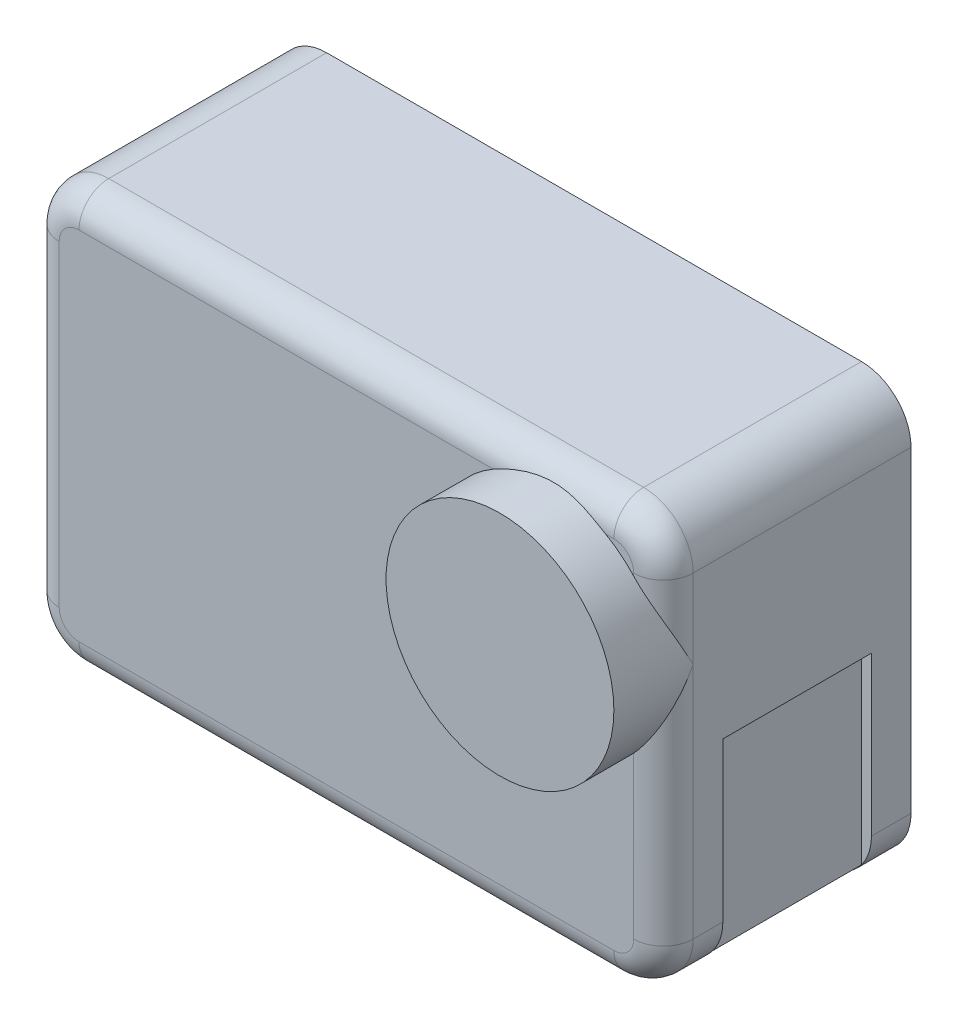
ISO-10303-21;
HEADER;
FILE_DESCRIPTION(('STEP AP214'),'2;1');
FILE_NAME('part.step','',(''),(''),'','','');
FILE_SCHEMA(('AUTOMOTIVE_DESIGN { 1 0 10303 214 1 1 1 1 }'));
ENDSEC;
DATA;
#1=APPLICATION_CONTEXT('core data for automotive mechanical design processes');
#2=APPLICATION_PROTOCOL_DEFINITION('international standard','automotive_design',2000,#1);
#3=PRODUCT_CONTEXT('',#1,'mechanical');
#4=PRODUCT('Part','Part','',(#3));
#5=PRODUCT_RELATED_PRODUCT_CATEGORY('part','',(#4));
#6=PRODUCT_DEFINITION_FORMATION('','',#4);
#7=PRODUCT_DEFINITION_CONTEXT('part definition',#1,'design');
#8=PRODUCT_DEFINITION('design','',#6,#7);
#9=PRODUCT_DEFINITION_SHAPE('','',#8);
#10=(LENGTH_UNIT() NAMED_UNIT(*) SI_UNIT(.MILLI.,.METRE.));
#11=(NAMED_UNIT(*) PLANE_ANGLE_UNIT() SI_UNIT($,.RADIAN.));
#12=(NAMED_UNIT(*) SI_UNIT($,.STERADIAN.) SOLID_ANGLE_UNIT());
#13=UNCERTAINTY_MEASURE_WITH_UNIT(LENGTH_MEASURE(1.E-05),#10,'distance_accuracy_value','');
#14=(GEOMETRIC_REPRESENTATION_CONTEXT(3) GLOBAL_UNCERTAINTY_ASSIGNED_CONTEXT((#13)) GLOBAL_UNIT_ASSIGNED_CONTEXT((#10,
#11,#12)) REPRESENTATION_CONTEXT('',''));
#15=CARTESIAN_POINT('',(0.,0.,0.));
#16=DIRECTION('',(0.,0.,1.));
#17=DIRECTION('',(1.,0.,0.));
#18=AXIS2_PLACEMENT_3D('',#15,#16,#17);
#19=CARTESIAN_POINT('',(59.,5.,25.));
#20=DIRECTION('',(0.,0.,-1.));
#21=DIRECTION('',(-1.,0.,0.));
#22=AXIS2_PLACEMENT_3D('',#19,#20,#21);
#23=CYLINDRICAL_SURFACE('',#22,5.);
#24=CARTESIAN_POINT('',(59.,5.,4.));
#25=DIRECTION('',(0.,0.,-1.));
#26=DIRECTION('',(-1.,0.,0.));
#27=AXIS2_PLACEMENT_3D('',#24,#25,#26);
#28=CIRCLE('',#27,5.);
#29=CARTESIAN_POINT('',(59.,0.,4.));
#30=VERTEX_POINT('',#29);
#31=CARTESIAN_POINT('',(63.,2.,4.));
#32=VERTEX_POINT('',#31);
#33=EDGE_CURVE('E11',#30,#32,#28,.F.);
#34=ORIENTED_EDGE('',*,*,#33,.F.);
#35=DIRECTION('',(0.,0.,-1.));
#36=VECTOR('',#35,1.);
#37=CARTESIAN_POINT('',(59.,0.,25.));
#38=LINE('',#37,#36);
#39=CARTESIAN_POINT('',(59.,0.,0.));
#40=VERTEX_POINT('',#39);
#41=EDGE_CURVE('E401',#40,#30,#38,.F.);
#42=ORIENTED_EDGE('',*,*,#41,.F.);
#43=CARTESIAN_POINT('',(59.,5.,0.));
#44=DIRECTION('',(0.,0.,-1.));
#45=DIRECTION('',(-1.,0.,0.));
#46=AXIS2_PLACEMENT_3D('',#43,#44,#45);
#47=CIRCLE('',#46,5.);
#48=CARTESIAN_POINT('',(64.,5.,0.));
#49=VERTEX_POINT('',#48);
#50=EDGE_CURVE('E406',#49,#40,#47,.T.);
#51=ORIENTED_EDGE('',*,*,#50,.F.);
#52=DIRECTION('',(0.,0.,-1.));
#53=VECTOR('',#52,1.);
#54=CARTESIAN_POINT('',(64.,5.,25.));
#55=LINE('',#54,#53);
#56=CARTESIAN_POINT('',(64.,5.00000000000001,4.));
#57=VERTEX_POINT('',#56);
#58=EDGE_CURVE('E416',#57,#49,#55,.T.);
#59=ORIENTED_EDGE('',*,*,#58,.F.);
#60=CARTESIAN_POINT('',(59.,5.,4.));
#61=DIRECTION('',(0.,0.,-1.));
#62=DIRECTION('',(0.,1.,0.));
#63=AXIS2_PLACEMENT_3D('',#60,#61,#62);
#64=CIRCLE('',#63,5.);
#65=EDGE_CURVE('E324',#32,#57,#64,.F.);
#66=ORIENTED_EDGE('',*,*,#65,.F.);
#67=EDGE_LOOP('',(#34,#42,#51,#59,#66));
#68=FACE_BOUND('',#67,.T.);
#69=ADVANCED_FACE('F36',(#68),#23,.T.);
#70=CARTESIAN_POINT('',(0.,0.,25.));
#71=DIRECTION('',(0.,0.,-1.));
#72=DIRECTION('',(-1.,0.,0.));
#73=AXIS2_PLACEMENT_3D('',#70,#71,#72);
#74=PLANE('',#73);
#75=CARTESIAN_POINT('',(52.5,29.,25.));
#76=DIRECTION('',(0.,0.,1.));
#77=DIRECTION('',(1.,0.,0.));
#78=AXIS2_PLACEMENT_3D('',#75,#76,#77);
#79=CIRCLE('',#78,11.5);
#80=CARTESIAN_POINT('',(61.,36.7459666924149,25.));
#81=VERTEX_POINT('',#80);
#82=CARTESIAN_POINT('',(58.1789083458003,39.,25.));
#83=VERTEX_POINT('',#82);
#84=EDGE_CURVE('E432',#81,#83,#79,.T.);
#85=ORIENTED_EDGE('',*,*,#84,.F.);
#86=DIRECTION('',(0.,1.,0.));
#87=VECTOR('',#86,1.);
#88=CARTESIAN_POINT('',(61.,0.,25.));
#89=LINE('',#88,#87);
#90=CARTESIAN_POINT('',(61.,37.,25.));
#91=VERTEX_POINT('',#90);
#92=EDGE_CURVE('E375',#81,#91,#89,.T.);
#93=ORIENTED_EDGE('',*,*,#92,.T.);
#94=CARTESIAN_POINT('',(59.,37.,25.));
#95=DIRECTION('',(0.,0.,-1.));
#96=DIRECTION('',(-1.,0.,0.));
#97=AXIS2_PLACEMENT_3D('',#94,#95,#96);
#98=CIRCLE('',#97,2.);
#99=CARTESIAN_POINT('',(59.,39.,25.));
#100=VERTEX_POINT('',#99);
#101=EDGE_CURVE('E376',#91,#100,#98,.F.);
#102=ORIENTED_EDGE('',*,*,#101,.T.);
#103=DIRECTION('',(-1.,0.,0.));
#104=VECTOR('',#103,1.);
#105=CARTESIAN_POINT('',(0.,39.,25.));
#106=LINE('',#105,#104);
#107=EDGE_CURVE('E388',#100,#83,#106,.T.);
#108=ORIENTED_EDGE('',*,*,#107,.T.);
#109=EDGE_LOOP('',(#85,#93,#102,#108));
#110=FACE_BOUND('',#109,.T.);
#111=ADVANCED_FACE('F285',(#110),#74,.F.);
#112=CARTESIAN_POINT('',(46.8210916541997,39.,25.));
#113=VERTEX_POINT('',#112);
#114=CARTESIAN_POINT('',(61.,21.2540333075852,25.));
#115=VERTEX_POINT('',#114);
#116=EDGE_CURVE('E51',#113,#115,#79,.T.);
#117=ORIENTED_EDGE('',*,*,#116,.F.);
#118=CARTESIAN_POINT('',(5.,39.,25.));
#119=VERTEX_POINT('',#118);
#120=EDGE_CURVE('E391',#113,#119,#106,.T.);
#121=ORIENTED_EDGE('',*,*,#120,.T.);
#122=CARTESIAN_POINT('',(5.,37.,25.));
#123=DIRECTION('',(0.,0.,-1.));
#124=DIRECTION('',(-1.,0.,0.));
#125=AXIS2_PLACEMENT_3D('',#122,#123,#124);
#126=CIRCLE('',#125,2.);
#127=CARTESIAN_POINT('',(3.,37.,25.));
#128=VERTEX_POINT('',#127);
#129=EDGE_CURVE('E386',#119,#128,#126,.F.);
#130=ORIENTED_EDGE('',*,*,#129,.T.);
#131=DIRECTION('',(0.,-1.,0.));
#132=VECTOR('',#131,1.);
#133=CARTESIAN_POINT('',(3.,0.,25.));
#134=LINE('',#133,#132);
#135=CARTESIAN_POINT('',(3.,5.,25.));
#136=VERTEX_POINT('',#135);
#137=EDGE_CURVE('E384',#128,#136,#134,.T.);
#138=ORIENTED_EDGE('',*,*,#137,.T.);
#139=CARTESIAN_POINT('',(5.,5.,25.));
#140=DIRECTION('',(0.,0.,-1.));
#141=DIRECTION('',(-1.,0.,0.));
#142=AXIS2_PLACEMENT_3D('',#139,#140,#141);
#143=CIRCLE('',#142,2.);
#144=CARTESIAN_POINT('',(5.,3.,25.));
#145=VERTEX_POINT('',#144);
#146=EDGE_CURVE('E382',#136,#145,#143,.F.);
#147=ORIENTED_EDGE('',*,*,#146,.T.);
#148=DIRECTION('',(1.,0.,0.));
#149=VECTOR('',#148,1.);
#150=CARTESIAN_POINT('',(0.,3.,25.));
#151=LINE('',#150,#149);
#152=CARTESIAN_POINT('',(59.,3.,25.));
#153=VERTEX_POINT('',#152);
#154=EDGE_CURVE('E380',#145,#153,#151,.T.);
#155=ORIENTED_EDGE('',*,*,#154,.T.);
#156=CARTESIAN_POINT('',(59.,5.,25.));
#157=DIRECTION('',(0.,0.,-1.));
#158=DIRECTION('',(-1.,0.,0.));
#159=AXIS2_PLACEMENT_3D('',#156,#157,#158);
#160=CIRCLE('',#159,2.);
#161=CARTESIAN_POINT('',(61.,5.,25.));
#162=VERTEX_POINT('',#161);
#163=EDGE_CURVE('E378',#153,#162,#160,.F.);
#164=ORIENTED_EDGE('',*,*,#163,.T.);
#165=EDGE_CURVE('E372',#162,#115,#89,.T.);
#166=ORIENTED_EDGE('',*,*,#165,.T.);
#167=EDGE_LOOP('',(#117,#121,#130,#138,#147,#155,#164,#166));
#168=FACE_BOUND('',#167,.T.);
#169=ADVANCED_FACE('F292',(#168),#74,.F.);
#170=CARTESIAN_POINT('',(0.,39.,22.));
#171=DIRECTION('',(-1.,0.,0.));
#172=DIRECTION('',(0.,0.,1.));
#173=AXIS2_PLACEMENT_3D('',#170,#171,#172);
#174=CYLINDRICAL_SURFACE('',#173,3.);
#175=ORIENTED_EDGE('',*,*,#120,.F.);
#176=CARTESIAN_POINT('',(46.8210916541997,39.,25.));
#177=CARTESIAN_POINT('',(46.9312920284884,39.0625832129958,24.9999925755767));
#178=CARTESIAN_POINT('',(47.0425033840844,39.1233284402952,24.998042635285));
#179=CARTESIAN_POINT('',(47.2667614155485,39.2410566690063,24.990882434184));
#180=CARTESIAN_POINT('',(47.3798075872742,39.2980406827716,24.9856730546614));
#181=CARTESIAN_POINT('',(47.7211997178972,39.4631214393157,24.9661081932755));
#182=CARTESIAN_POINT('',(47.9520990332852,39.565517000314,24.9478125742997));
#183=CARTESIAN_POINT('',(48.4206237534266,39.7551323665193,24.9050401827988));
#184=CARTESIAN_POINT('',(48.6582745013806,39.8422826653431,24.8805362864244));
#185=CARTESIAN_POINT('',(49.1386960637035,40.0007108788758,24.8294002104147));
#186=CARTESIAN_POINT('',(49.3814691944716,40.0719814365583,24.8027670520323));
#187=CARTESIAN_POINT('',(49.915257961741,40.2097314556453,24.7464618783123));
#188=CARTESIAN_POINT('',(50.2071255154597,40.2730659729555,24.7171000662591));
#189=CARTESIAN_POINT('',(50.7955480157014,40.3769093274429,24.6659874217498));
#190=CARTESIAN_POINT('',(51.0921023739542,40.4174210062293,24.644235641917));
#191=CARTESIAN_POINT('',(51.6872698298636,40.4751282864436,24.6124894283187));
#192=CARTESIAN_POINT('',(51.9858744575288,40.4923911981463,24.6024610638702));
#193=CARTESIAN_POINT('',(52.5836545807069,40.5035800740727,24.5960152643435));
#194=CARTESIAN_POINT('',(52.8828300294512,40.4975078745011,24.5995967583258));
#195=CARTESIAN_POINT('',(53.4767608038558,40.4622725914634,24.6195698379878));
#196=CARTESIAN_POINT('',(53.7715319935961,40.4333092321379,24.6358506071837));
#197=CARTESIAN_POINT('',(54.3573240132397,40.3528764975891,24.6780151295318));
#198=CARTESIAN_POINT('',(54.6483438423048,40.3014012392419,24.7039013926576));
#199=CARTESIAN_POINT('',(55.22549684081,40.1762693966859,24.7606341031264));
#200=CARTESIAN_POINT('',(55.511622350435,40.102580902814,24.7914876561523));
#201=CARTESIAN_POINT('',(56.0773103697999,39.9334342907134,24.8525040282952));
#202=CARTESIAN_POINT('',(56.3568754188939,39.8379847540922,24.8826671145562));
#203=CARTESIAN_POINT('',(56.8986462577012,39.6293503561641,24.9351454017339));
#204=CARTESIAN_POINT('',(57.1611155736016,39.5169193148343,24.9577021020825));
#205=CARTESIAN_POINT('',(57.5481538648569,39.333753605377,24.9820102433633));
#206=CARTESIAN_POINT('',(57.6759233851797,39.2703535924066,24.9885232576441));
#207=CARTESIAN_POINT('',(57.929192014153,39.1387504394423,24.9975133173294));
#208=CARTESIAN_POINT('',(58.0546898599188,39.0705447250245,24.9999881820754));
#209=CARTESIAN_POINT('',(58.1789083458003,39.,25.));
#210=B_SPLINE_CURVE_WITH_KNOTS('',3,(#176,#177,#178,#179,#180,#181,#182,#183,#184,#185,#186,
#187,#188,#189,#190,#191,#192,#193,#194,#195,#196,#197,#198,#199,#200,#201,#202,#203,#204,#205,
#206,#207,#208,#209),.UNSPECIFIED.,.F.,.F.,(4,2,2,2,2,2,2,2,2,2,2,2,2,2,2,2,4),(0.,
0.380114763041625,0.760126795095938,1.51911991104775,2.28148802603012,3.04420861233901,
3.94355073296267,4.84278085419231,5.73940186966129,6.6359523328242,7.52476565925836,
8.41381140173018,9.30414040819435,10.1941189131429,11.0523607385532,11.4805722009098,
11.9090148271547),.UNSPECIFIED.);
#211=EDGE_CURVE('E245',#113,#83,#210,.T.);
#212=ORIENTED_EDGE('',*,*,#211,.T.);
#213=ORIENTED_EDGE('',*,*,#107,.F.);
#214=CARTESIAN_POINT('',(59.,39.,22.));
#215=DIRECTION('',(1.,0.,0.));
#216=DIRECTION('',(0.,0.,-1.));
#217=AXIS2_PLACEMENT_3D('',#214,#215,#216);
#218=CIRCLE('',#217,3.);
#219=CARTESIAN_POINT('',(59.,42.,22.));
#220=VERTEX_POINT('',#219);
#221=EDGE_CURVE('E346',#220,#100,#218,.T.);
#222=ORIENTED_EDGE('',*,*,#221,.F.);
#223=DIRECTION('',(-1.,0.,0.));
#224=VECTOR('',#223,1.);
#225=CARTESIAN_POINT('',(0.,42.,22.));
#226=LINE('',#225,#224);
#227=CARTESIAN_POINT('',(5.,42.,22.));
#228=VERTEX_POINT('',#227);
#229=EDGE_CURVE('E329',#228,#220,#226,.F.);
#230=ORIENTED_EDGE('',*,*,#229,.F.);
#231=CARTESIAN_POINT('',(5.,39.,22.));
#232=DIRECTION('',(1.,0.,0.));
#233=DIRECTION('',(0.,0.,-1.));
#234=AXIS2_PLACEMENT_3D('',#231,#232,#233);
#235=CIRCLE('',#234,3.);
#236=EDGE_CURVE('E340',#228,#119,#235,.T.);
#237=ORIENTED_EDGE('',*,*,#236,.T.);
#238=EDGE_LOOP('',(#175,#212,#213,#222,#230,#237));
#239=FACE_BOUND('',#238,.T.);
#240=ADVANCED_FACE('F495',(#239),#174,.T.);
#241=CARTESIAN_POINT('',(61.,0.,22.));
#242=DIRECTION('',(0.,1.,0.));
#243=DIRECTION('',(0.,0.,1.));
#244=AXIS2_PLACEMENT_3D('',#241,#242,#243);
#245=CYLINDRICAL_SURFACE('',#244,3.);
#246=ORIENTED_EDGE('',*,*,#92,.F.);
#247=CARTESIAN_POINT('',(61.,36.7459666924149,25.));
#248=CARTESIAN_POINT('',(61.063461306996,36.6763300190639,24.9999964500349));
#249=CARTESIAN_POINT('',(61.12604901003,36.6059281599659,24.9979868056309));
#250=CARTESIAN_POINT('',(61.2493623968715,36.4637459720662,24.9902572002287));
#251=CARTESIAN_POINT('',(61.3100886325121,36.3919660622542,24.9845383501881));
#252=CARTESIAN_POINT('',(61.4891156257345,36.1750189459312,24.9622988554927));
#253=CARTESIAN_POINT('',(61.6045240992846,36.0279594427748,24.9406927686557));
#254=CARTESIAN_POINT('',(61.8261207484665,35.7310860361167,24.8862494980347));
#255=CARTESIAN_POINT('',(61.9323779326379,35.5813054321129,24.8535077046564));
#256=CARTESIAN_POINT('',(62.1366333033584,35.2784305879812,24.7784717445897));
#257=CARTESIAN_POINT('',(62.2346260101073,35.1253342325626,24.7361713073242));
#258=CARTESIAN_POINT('',(62.4730453009392,34.7328800015026,24.6184284679135));
#259=CARTESIAN_POINT('',(62.6077318454755,34.4916832180854,24.5374400079614));
#260=CARTESIAN_POINT('',(62.8575354426057,34.0046416088632,24.3607150147749));
#261=CARTESIAN_POINT('',(62.9726458685751,33.7587952403167,24.2649735083736));
#262=CARTESIAN_POINT('',(63.1843511935625,33.2623730429794,24.061615905152));
#263=CARTESIAN_POINT('',(63.2808461875369,33.0117792124556,23.9539403670162));
#264=CARTESIAN_POINT('',(63.4551096809288,32.5080760044241,23.7299057228271));
#265=CARTESIAN_POINT('',(63.5328808949644,32.2549669971202,23.6135478787633));
#266=CARTESIAN_POINT('',(63.668219568314,31.7542923731395,23.3778682613467));
#267=CARTESIAN_POINT('',(63.7263102932143,31.506780480356,23.2587320136248));
#268=CARTESIAN_POINT('',(63.8257096346067,31.0105635603008,23.0161470430761));
#269=CARTESIAN_POINT('',(63.8670166987158,30.7618584248133,22.892697922482));
#270=CARTESIAN_POINT('',(63.9659915276922,30.0159195155851,22.5188539470501));
#271=CARTESIAN_POINT('',(63.9991571506779,29.5171977573142,22.2641604171744));
#272=CARTESIAN_POINT('',(63.999994708873,29.0127335387396,22.0065037007156));
#273=CARTESIAN_POINT('',(63.999999995953,29.0063667156248,22.0032518204684));
#274=CARTESIAN_POINT('',(64.,29.,22.));
#275=B_SPLINE_CURVE_WITH_KNOTS('',3,(#247,#248,#249,#250,#251,#252,#253,#254,#255,#256,#257,
#258,#259,#260,#261,#262,#263,#264,#265,#266,#267,#268,#269,#270,#271,#272,#273,#274),
.UNSPECIFIED.,.F.,.F.,(4,2,2,2,2,2,2,2,2,2,2,2,2,4),(0.,0.282580373546597,0.565076149485665,
1.12891592750663,1.68804256945861,2.2475370750814,3.10986025961736,3.97247476680195,
4.83959725847824,5.70659395686845,6.54829500866234,7.39007389480043,9.06796384520321,
9.08941146168441),.UNSPECIFIED.);
#276=CARTESIAN_POINT('',(64.,29.,22.));
#277=VERTEX_POINT('',#276);
#278=EDGE_CURVE('E234',#81,#277,#275,.T.);
#279=ORIENTED_EDGE('',*,*,#278,.T.);
#280=DIRECTION('',(0.,1.,0.));
#281=VECTOR('',#280,1.);
#282=CARTESIAN_POINT('',(64.,0.,22.));
#283=LINE('',#282,#281);
#284=CARTESIAN_POINT('',(64.,37.,22.));
#285=VERTEX_POINT('',#284);
#286=EDGE_CURVE('E368',#285,#277,#283,.F.);
#287=ORIENTED_EDGE('',*,*,#286,.F.);
#288=CARTESIAN_POINT('',(61.,37.,22.));
#289=DIRECTION('',(0.,-1.,0.));
#290=DIRECTION('',(0.,0.,-1.));
#291=AXIS2_PLACEMENT_3D('',#288,#289,#290);
#292=CIRCLE('',#291,3.);
#293=EDGE_CURVE('E352',#285,#91,#292,.T.);
#294=ORIENTED_EDGE('',*,*,#293,.T.);
#295=EDGE_LOOP('',(#246,#279,#287,#294));
#296=FACE_BOUND('',#295,.T.);
#297=ADVANCED_FACE('F468',(#296),#245,.T.);
#298=CARTESIAN_POINT('',(64.,5.,22.));
#299=VERTEX_POINT('',#298);
#300=EDGE_CURVE('E371',#277,#299,#283,.F.);
#301=ORIENTED_EDGE('',*,*,#300,.F.);
#302=CARTESIAN_POINT('',(61.,21.2540333075852,25.));
#303=CARTESIAN_POINT('',(61.063461306996,21.3236699809361,24.9999964500349));
#304=CARTESIAN_POINT('',(61.12604901003,21.3940718400341,24.9979868056309));
#305=CARTESIAN_POINT('',(61.2493623968715,21.5362540279338,24.9902572002287));
#306=CARTESIAN_POINT('',(61.3100886325121,21.6080339377458,24.9845383501881));
#307=CARTESIAN_POINT('',(61.4891156257344,21.8249810540688,24.9622988554928));
#308=CARTESIAN_POINT('',(61.6045240992845,21.9720405572252,24.9406927686557));
#309=CARTESIAN_POINT('',(61.8261207484665,22.2689139638833,24.8862494980347));
#310=CARTESIAN_POINT('',(61.9323779326379,22.4186945678871,24.8535077046564));
#311=CARTESIAN_POINT('',(62.1366333033584,22.7215694120188,24.7784717445897));
#312=CARTESIAN_POINT('',(62.2346260101073,22.8746657674374,24.7361713073242));
#313=CARTESIAN_POINT('',(62.4730453009392,23.2671199984974,24.6184284679135));
#314=CARTESIAN_POINT('',(62.6077318454755,23.5083167819146,24.5374400079614));
#315=CARTESIAN_POINT('',(62.8575354426057,23.9953583911369,24.3607150147749));
#316=CARTESIAN_POINT('',(62.9726458685751,24.2412047596833,24.2649735083736));
#317=CARTESIAN_POINT('',(63.1843511935625,24.7376269570206,24.061615905152));
#318=CARTESIAN_POINT('',(63.2808461875369,24.9882207875444,23.9539403670162));
#319=CARTESIAN_POINT('',(63.4551096809288,25.4919239955759,23.7299057228271));
#320=CARTESIAN_POINT('',(63.5328808949644,25.7450330028798,23.6135478787633));
#321=CARTESIAN_POINT('',(63.668219568314,26.2457076268605,23.3778682613467));
#322=CARTESIAN_POINT('',(63.7263102932143,26.493219519644,23.2587320136248));
#323=CARTESIAN_POINT('',(63.8257096346067,26.9894364396992,23.0161470430762));
#324=CARTESIAN_POINT('',(63.8670166987158,27.2381415751868,22.8926979224821));
#325=CARTESIAN_POINT('',(63.9659915276922,27.9840804844148,22.51885394705));
#326=CARTESIAN_POINT('',(63.9991571506779,28.4828022426854,22.2641604171736));
#327=CARTESIAN_POINT('',(63.999994708873,28.9872664612604,22.0065037007156));
#328=CARTESIAN_POINT('',(63.999999995953,28.9936332843752,22.0032518204684));
#329=CARTESIAN_POINT('',(64.,29.,22.));
#330=B_SPLINE_CURVE_WITH_KNOTS('',3,(#302,#303,#304,#305,#306,#307,#308,#309,#310,#311,#312,
#313,#314,#315,#316,#317,#318,#319,#320,#321,#322,#323,#324,#325,#326,#327,#328,#329),
.UNSPECIFIED.,.F.,.F.,(4,2,2,2,2,2,2,2,2,2,2,2,2,4),(0.,0.282580373546597,0.565076149485645,
1.12891592750659,1.6880425694586,2.24753707508139,3.10986025961737,3.97247476680197,
4.83959725847826,5.70659395686846,6.54829500866235,7.39007389480043,9.06796384520321,
9.08941146168441),.UNSPECIFIED.);
#331=EDGE_CURVE('E237',#277,#115,#330,.F.);
#332=ORIENTED_EDGE('',*,*,#331,.T.);
#333=ORIENTED_EDGE('',*,*,#165,.F.);
#334=CARTESIAN_POINT('',(61.,5.,22.));
#335=DIRECTION('',(0.,1.,0.));
#336=DIRECTION('',(0.,0.,1.));
#337=AXIS2_PLACEMENT_3D('',#334,#335,#336);
#338=CIRCLE('',#337,3.);
#339=EDGE_CURVE('E349',#162,#299,#338,.T.);
#340=ORIENTED_EDGE('',*,*,#339,.T.);
#341=EDGE_LOOP('',(#301,#332,#333,#340));
#342=FACE_BOUND('',#341,.T.);
#343=ADVANCED_FACE('F463',(#342),#245,.T.);
#344=CARTESIAN_POINT('',(0.,0.,25.));
#345=DIRECTION('',(1.,0.,0.));
#346=DIRECTION('',(0.,0.,-1.));
#347=AXIS2_PLACEMENT_3D('',#344,#345,#346);
#348=PLANE('',#347);
#349=DIRECTION('',(0.,0.,-1.));
#350=VECTOR('',#349,1.);
#351=CARTESIAN_POINT('',(0.,5.,25.));
#352=LINE('',#351,#350);
#353=CARTESIAN_POINT('',(0.,5.,0.));
#354=VERTEX_POINT('',#353);
#355=CARTESIAN_POINT('',(0.,5.,22.));
#356=VERTEX_POINT('',#355);
#357=EDGE_CURVE('E396',#354,#356,#352,.F.);
#358=ORIENTED_EDGE('',*,*,#357,.T.);
#359=DIRECTION('',(0.,-1.,0.));
#360=VECTOR('',#359,1.);
#361=CARTESIAN_POINT('',(0.,0.,22.));
#362=LINE('',#361,#360);
#363=CARTESIAN_POINT('',(0.,37.,22.));
#364=VERTEX_POINT('',#363);
#365=EDGE_CURVE('E358',#356,#364,#362,.F.);
#366=ORIENTED_EDGE('',*,*,#365,.T.);
#367=DIRECTION('',(0.,0.,-1.));
#368=VECTOR('',#367,1.);
#369=CARTESIAN_POINT('',(0.,37.,25.));
#370=LINE('',#369,#368);
#371=CARTESIAN_POINT('',(0.,37.,0.));
#372=VERTEX_POINT('',#371);
#373=EDGE_CURVE('E399',#364,#372,#370,.T.);
#374=ORIENTED_EDGE('',*,*,#373,.T.);
#375=DIRECTION('',(0.,-1.,0.));
#376=VECTOR('',#375,1.);
#377=CARTESIAN_POINT('',(0.,0.,0.));
#378=LINE('',#377,#376);
#379=EDGE_CURVE('E333',#372,#354,#378,.T.);
#380=ORIENTED_EDGE('',*,*,#379,.T.);
#381=EDGE_LOOP('',(#358,#366,#374,#380));
#382=FACE_BOUND('',#381,.T.);
#383=ADVANCED_FACE('F460',(#382),#348,.F.);
#384=CARTESIAN_POINT('',(0.,0.,25.));
#385=DIRECTION('',(0.,1.,0.));
#386=DIRECTION('',(0.,0.,1.));
#387=AXIS2_PLACEMENT_3D('',#384,#385,#386);
#388=PLANE('',#387);
#389=ORIENTED_EDGE('',*,*,#41,.T.);
#390=DIRECTION('',(1.,0.,0.));
#391=VECTOR('',#390,1.);
#392=CARTESIAN_POINT('',(58.,0.,4.));
#393=LINE('',#392,#391);
#394=CARTESIAN_POINT('',(58.,0.,4.));
#395=VERTEX_POINT('',#394);
#396=EDGE_CURVE('E210',#395,#30,#393,.T.);
#397=ORIENTED_EDGE('',*,*,#396,.F.);
#398=DIRECTION('',(0.,0.,-1.));
#399=VECTOR('',#398,1.);
#400=CARTESIAN_POINT('',(58.,0.,4.));
#401=LINE('',#400,#399);
#402=CARTESIAN_POINT('',(58.,0.,19.));
#403=VERTEX_POINT('',#402);
#404=EDGE_CURVE('E193',#403,#395,#401,.T.);
#405=ORIENTED_EDGE('',*,*,#404,.F.);
#406=DIRECTION('',(1.,0.,0.));
#407=VECTOR('',#406,1.);
#408=CARTESIAN_POINT('',(58.,0.,19.));
#409=LINE('',#408,#407);
#410=CARTESIAN_POINT('',(59.,0.,19.));
#411=VERTEX_POINT('',#410);
#412=EDGE_CURVE('E213',#403,#411,#409,.T.);
#413=ORIENTED_EDGE('',*,*,#412,.T.);
#414=CARTESIAN_POINT('',(59.,0.,22.));
#415=VERTEX_POINT('',#414);
#416=EDGE_CURVE('E318',#411,#415,#38,.F.);
#417=ORIENTED_EDGE('',*,*,#416,.T.);
#418=DIRECTION('',(1.,0.,0.));
#419=VECTOR('',#418,1.);
#420=CARTESIAN_POINT('',(0.,0.,22.));
#421=LINE('',#420,#419);
#422=CARTESIAN_POINT('',(5.,0.,22.));
#423=VERTEX_POINT('',#422);
#424=EDGE_CURVE('E362',#415,#423,#421,.F.);
#425=ORIENTED_EDGE('',*,*,#424,.T.);
#426=DIRECTION('',(0.,0.,-1.));
#427=VECTOR('',#426,1.);
#428=CARTESIAN_POINT('',(5.,0.,25.));
#429=LINE('',#428,#427);
#430=CARTESIAN_POINT('',(5.,0.,0.));
#431=VERTEX_POINT('',#430);
#432=EDGE_CURVE('E404',#423,#431,#429,.T.);
#433=ORIENTED_EDGE('',*,*,#432,.T.);
#434=DIRECTION('',(1.,0.,0.));
#435=VECTOR('',#434,1.);
#436=CARTESIAN_POINT('',(0.,0.,0.));
#437=LINE('',#436,#435);
#438=EDGE_CURVE('E426',#431,#40,#437,.T.);
#439=ORIENTED_EDGE('',*,*,#438,.T.);
#440=EDGE_LOOP('',(#389,#397,#405,#413,#417,#425,#433,#439));
#441=FACE_BOUND('',#440,.T.);
#442=ADVANCED_FACE('F457',(#441),#388,.F.);
#443=CARTESIAN_POINT('',(64.,0.,25.));
#444=DIRECTION('',(-1.,0.,0.));
#445=DIRECTION('',(0.,0.,1.));
#446=AXIS2_PLACEMENT_3D('',#443,#444,#445);
#447=PLANE('',#446);
#448=CARTESIAN_POINT('',(64.,5.00000000000001,19.));
#449=VERTEX_POINT('',#448);
#450=EDGE_CURVE('E414',#299,#449,#55,.T.);
#451=ORIENTED_EDGE('',*,*,#450,.T.);
#452=DIRECTION('',(0.,-1.,0.));
#453=VECTOR('',#452,1.);
#454=CARTESIAN_POINT('',(64.,21.,19.));
#455=LINE('',#454,#453);
#456=CARTESIAN_POINT('',(64.,21.,19.));
#457=VERTEX_POINT('',#456);
#458=EDGE_CURVE('E212',#457,#449,#455,.T.);
#459=ORIENTED_EDGE('',*,*,#458,.F.);
#460=DIRECTION('',(0.,0.,1.));
#461=VECTOR('',#460,1.);
#462=CARTESIAN_POINT('',(64.,21.,19.));
#463=LINE('',#462,#461);
#464=CARTESIAN_POINT('',(64.,21.,4.));
#465=VERTEX_POINT('',#464);
#466=EDGE_CURVE('E221',#465,#457,#463,.T.);
#467=ORIENTED_EDGE('',*,*,#466,.F.);
#468=DIRECTION('',(0.,1.,0.));
#469=VECTOR('',#468,1.);
#470=CARTESIAN_POINT('',(64.,21.,4.));
#471=LINE('',#470,#469);
#472=EDGE_CURVE('E228',#57,#465,#471,.T.);
#473=ORIENTED_EDGE('',*,*,#472,.F.);
#474=ORIENTED_EDGE('',*,*,#58,.T.);
#475=DIRECTION('',(0.,1.,0.));
#476=VECTOR('',#475,1.);
#477=CARTESIAN_POINT('',(64.,0.,0.));
#478=LINE('',#477,#476);
#479=CARTESIAN_POINT('',(64.,37.,0.));
#480=VERTEX_POINT('',#479);
#481=EDGE_CURVE('E423',#49,#480,#478,.T.);
#482=ORIENTED_EDGE('',*,*,#481,.T.);
#483=DIRECTION('',(0.,0.,-1.));
#484=VECTOR('',#483,1.);
#485=CARTESIAN_POINT('',(64.,37.,25.));
#486=LINE('',#485,#484);
#487=EDGE_CURVE('E417',#480,#285,#486,.F.);
#488=ORIENTED_EDGE('',*,*,#487,.T.);
#489=ORIENTED_EDGE('',*,*,#286,.T.);
#490=ORIENTED_EDGE('',*,*,#300,.T.);
#491=EDGE_LOOP('',(#451,#459,#467,#473,#474,#482,#488,#489,#490));
#492=FACE_BOUND('',#491,.T.);
#493=ADVANCED_FACE('F453',(#492),#447,.F.);
#494=CARTESIAN_POINT('',(0.,42.,25.));
#495=DIRECTION('',(0.,-1.,0.));
#496=DIRECTION('',(0.,0.,-1.));
#497=AXIS2_PLACEMENT_3D('',#494,#495,#496);
#498=PLANE('',#497);
#499=DIRECTION('',(0.,0.,-1.));
#500=VECTOR('',#499,1.);
#501=CARTESIAN_POINT('',(5.,42.,25.));
#502=LINE('',#501,#500);
#503=CARTESIAN_POINT('',(5.,42.,0.));
#504=VERTEX_POINT('',#503);
#505=EDGE_CURVE('E392',#504,#228,#502,.F.);
#506=ORIENTED_EDGE('',*,*,#505,.T.);
#507=ORIENTED_EDGE('',*,*,#229,.T.);
#508=DIRECTION('',(0.,0.,-1.));
#509=VECTOR('',#508,1.);
#510=CARTESIAN_POINT('',(59.,42.,25.));
#511=LINE('',#510,#509);
#512=CARTESIAN_POINT('',(59.,42.,0.));
#513=VERTEX_POINT('',#512);
#514=EDGE_CURVE('E394',#220,#513,#511,.T.);
#515=ORIENTED_EDGE('',*,*,#514,.T.);
#516=DIRECTION('',(-1.,0.,0.));
#517=VECTOR('',#516,1.);
#518=CARTESIAN_POINT('',(0.,42.,0.));
#519=LINE('',#518,#517);
#520=EDGE_CURVE('E420',#513,#504,#519,.T.);
#521=ORIENTED_EDGE('',*,*,#520,.T.);
#522=EDGE_LOOP('',(#506,#507,#515,#521));
#523=FACE_BOUND('',#522,.T.);
#524=ADVANCED_FACE('F307',(#523),#498,.F.);
#525=CARTESIAN_POINT('',(0.,0.,0.));
#526=DIRECTION('',(0.,0.,-1.));
#527=DIRECTION('',(-1.,0.,0.));
#528=AXIS2_PLACEMENT_3D('',#525,#526,#527);
#529=PLANE('',#528);
#530=ORIENTED_EDGE('',*,*,#481,.F.);
#531=ORIENTED_EDGE('',*,*,#50,.T.);
#532=ORIENTED_EDGE('',*,*,#438,.F.);
#533=CARTESIAN_POINT('',(5.,5.,0.));
#534=DIRECTION('',(0.,0.,-1.));
#535=DIRECTION('',(-1.,0.,0.));
#536=AXIS2_PLACEMENT_3D('',#533,#534,#535);
#537=CIRCLE('',#536,5.);
#538=EDGE_CURVE('E408',#431,#354,#537,.T.);
#539=ORIENTED_EDGE('',*,*,#538,.T.);
#540=ORIENTED_EDGE('',*,*,#379,.F.);
#541=CARTESIAN_POINT('',(5.,37.,0.));
#542=DIRECTION('',(0.,0.,-1.));
#543=DIRECTION('',(-1.,0.,0.));
#544=AXIS2_PLACEMENT_3D('',#541,#542,#543);
#545=CIRCLE('',#544,5.);
#546=EDGE_CURVE('E410',#372,#504,#545,.T.);
#547=ORIENTED_EDGE('',*,*,#546,.T.);
#548=ORIENTED_EDGE('',*,*,#520,.F.);
#549=CARTESIAN_POINT('',(59.,37.,0.));
#550=DIRECTION('',(0.,0.,-1.));
#551=DIRECTION('',(-1.,0.,0.));
#552=AXIS2_PLACEMENT_3D('',#549,#550,#551);
#553=CIRCLE('',#552,5.);
#554=EDGE_CURVE('E412',#513,#480,#553,.T.);
#555=ORIENTED_EDGE('',*,*,#554,.T.);
#556=EDGE_LOOP('',(#530,#531,#532,#539,#540,#547,#548,#555));
#557=FACE_BOUND('',#556,.T.);
#558=ADVANCED_FACE('F299',(#557),#529,.T.);
#559=CARTESIAN_POINT('',(59.,5.,19.));
#560=DIRECTION('',(0.,0.,1.));
#561=DIRECTION('',(1.,0.,0.));
#562=AXIS2_PLACEMENT_3D('',#559,#560,#561);
#563=CIRCLE('',#562,5.);
#564=CARTESIAN_POINT('',(63.,2.,19.));
#565=VERTEX_POINT('',#564);
#566=EDGE_CURVE('E44',#565,#411,#563,.F.);
#567=ORIENTED_EDGE('',*,*,#566,.F.);
#568=CARTESIAN_POINT('',(59.,5.,19.));
#569=DIRECTION('',(0.,0.,1.));
#570=DIRECTION('',(0.,-1.,0.));
#571=AXIS2_PLACEMENT_3D('',#568,#569,#570);
#572=CIRCLE('',#571,5.);
#573=EDGE_CURVE('E315',#449,#565,#572,.F.);
#574=ORIENTED_EDGE('',*,*,#573,.F.);
#575=ORIENTED_EDGE('',*,*,#450,.F.);
#576=CARTESIAN_POINT('',(59.,5.,22.));
#577=DIRECTION('',(0.,0.,-1.));
#578=DIRECTION('',(-1.,0.,0.));
#579=AXIS2_PLACEMENT_3D('',#576,#577,#578);
#580=CIRCLE('',#579,5.);
#581=EDGE_CURVE('E364',#299,#415,#580,.T.);
#582=ORIENTED_EDGE('',*,*,#581,.T.);
#583=ORIENTED_EDGE('',*,*,#416,.F.);
#584=EDGE_LOOP('',(#567,#574,#575,#582,#583));
#585=FACE_BOUND('',#584,.T.);
#586=ADVANCED_FACE('F288',(#585),#23,.T.);
#587=CARTESIAN_POINT('',(5.,5.,25.));
#588=DIRECTION('',(0.,0.,-1.));
#589=DIRECTION('',(-1.,0.,0.));
#590=AXIS2_PLACEMENT_3D('',#587,#588,#589);
#591=CYLINDRICAL_SURFACE('',#590,5.);
#592=ORIENTED_EDGE('',*,*,#432,.F.);
#593=CARTESIAN_POINT('',(5.,5.,22.));
#594=DIRECTION('',(0.,0.,-1.));
#595=DIRECTION('',(-1.,0.,0.));
#596=AXIS2_PLACEMENT_3D('',#593,#594,#595);
#597=CIRCLE('',#596,5.);
#598=EDGE_CURVE('E360',#423,#356,#597,.T.);
#599=ORIENTED_EDGE('',*,*,#598,.T.);
#600=ORIENTED_EDGE('',*,*,#357,.F.);
#601=ORIENTED_EDGE('',*,*,#538,.F.);
#602=EDGE_LOOP('',(#592,#599,#600,#601));
#603=FACE_BOUND('',#602,.T.);
#604=ADVANCED_FACE('F298',(#603),#591,.T.);
#605=CARTESIAN_POINT('',(5.,37.,25.));
#606=DIRECTION('',(0.,0.,-1.));
#607=DIRECTION('',(-1.,0.,0.));
#608=AXIS2_PLACEMENT_3D('',#605,#606,#607);
#609=CYLINDRICAL_SURFACE('',#608,5.);
#610=ORIENTED_EDGE('',*,*,#373,.F.);
#611=CARTESIAN_POINT('',(5.,37.,22.));
#612=DIRECTION('',(0.,0.,-1.));
#613=DIRECTION('',(-1.,0.,0.));
#614=AXIS2_PLACEMENT_3D('',#611,#612,#613);
#615=CIRCLE('',#614,5.);
#616=EDGE_CURVE('E59',#364,#228,#615,.T.);
#617=ORIENTED_EDGE('',*,*,#616,.T.);
#618=ORIENTED_EDGE('',*,*,#505,.F.);
#619=ORIENTED_EDGE('',*,*,#546,.F.);
#620=EDGE_LOOP('',(#610,#617,#618,#619));
#621=FACE_BOUND('',#620,.T.);
#622=ADVANCED_FACE('F305',(#621),#609,.T.);
#623=CARTESIAN_POINT('',(59.,37.,25.));
#624=DIRECTION('',(0.,0.,-1.));
#625=DIRECTION('',(-1.,0.,0.));
#626=AXIS2_PLACEMENT_3D('',#623,#624,#625);
#627=CYLINDRICAL_SURFACE('',#626,5.);
#628=ORIENTED_EDGE('',*,*,#514,.F.);
#629=CARTESIAN_POINT('',(59.,37.,22.));
#630=DIRECTION('',(0.,0.,-1.));
#631=DIRECTION('',(-1.,0.,0.));
#632=AXIS2_PLACEMENT_3D('',#629,#630,#631);
#633=CIRCLE('',#632,5.);
#634=EDGE_CURVE('E366',#220,#285,#633,.T.);
#635=ORIENTED_EDGE('',*,*,#634,.T.);
#636=ORIENTED_EDGE('',*,*,#487,.F.);
#637=ORIENTED_EDGE('',*,*,#554,.F.);
#638=EDGE_LOOP('',(#628,#635,#636,#637));
#639=FACE_BOUND('',#638,.T.);
#640=ADVANCED_FACE('F501',(#639),#627,.T.);
#641=CARTESIAN_POINT('',(3.,0.,22.));
#642=DIRECTION('',(0.,-1.,0.));
#643=DIRECTION('',(0.,0.,-1.));
#644=AXIS2_PLACEMENT_3D('',#641,#642,#643);
#645=CYLINDRICAL_SURFACE('',#644,3.);
#646=CARTESIAN_POINT('',(3.,37.,22.));
#647=DIRECTION('',(0.,1.,0.));
#648=DIRECTION('',(0.,0.,1.));
#649=AXIS2_PLACEMENT_3D('',#646,#647,#648);
#650=CIRCLE('',#649,3.);
#651=EDGE_CURVE('E334',#364,#128,#650,.T.);
#652=ORIENTED_EDGE('',*,*,#651,.F.);
#653=ORIENTED_EDGE('',*,*,#365,.F.);
#654=CARTESIAN_POINT('',(3.,5.,22.));
#655=DIRECTION('',(0.,-1.,0.));
#656=DIRECTION('',(0.,0.,-1.));
#657=AXIS2_PLACEMENT_3D('',#654,#655,#656);
#658=CIRCLE('',#657,3.);
#659=EDGE_CURVE('E330',#136,#356,#658,.T.);
#660=ORIENTED_EDGE('',*,*,#659,.F.);
#661=ORIENTED_EDGE('',*,*,#137,.F.);
#662=EDGE_LOOP('',(#652,#653,#660,#661));
#663=FACE_BOUND('',#662,.T.);
#664=ADVANCED_FACE('F38',(#663),#645,.T.);
#665=CARTESIAN_POINT('',(5.,5.,22.));
#666=DIRECTION('',(0.,0.,-1.));
#667=DIRECTION('',(-1.,0.,0.));
#668=AXIS2_PLACEMENT_3D('',#665,#666,#667);
#669=DEGENERATE_TOROIDAL_SURFACE('',#668,2.,3.,.T.);
#670=ORIENTED_EDGE('',*,*,#659,.T.);
#671=ORIENTED_EDGE('',*,*,#598,.F.);
#672=CARTESIAN_POINT('',(5.,3.,22.));
#673=DIRECTION('',(1.,0.,0.));
#674=DIRECTION('',(0.,0.,-1.));
#675=AXIS2_PLACEMENT_3D('',#672,#673,#674);
#676=CIRCLE('',#675,3.);
#677=EDGE_CURVE('E337',#145,#423,#676,.T.);
#678=ORIENTED_EDGE('',*,*,#677,.F.);
#679=ORIENTED_EDGE('',*,*,#146,.F.);
#680=EDGE_LOOP('',(#670,#671,#678,#679));
#681=FACE_BOUND('',#680,.T.);
#682=ADVANCED_FACE('F482',(#681),#669,.T.);
#683=CARTESIAN_POINT('',(5.,37.,22.));
#684=DIRECTION('',(0.,0.,-1.));
#685=DIRECTION('',(-1.,0.,0.));
#686=AXIS2_PLACEMENT_3D('',#683,#684,#685);
#687=DEGENERATE_TOROIDAL_SURFACE('',#686,2.,3.,.T.);
#688=ORIENTED_EDGE('',*,*,#651,.T.);
#689=ORIENTED_EDGE('',*,*,#129,.F.);
#690=ORIENTED_EDGE('',*,*,#236,.F.);
#691=ORIENTED_EDGE('',*,*,#616,.F.);
#692=EDGE_LOOP('',(#688,#689,#690,#691));
#693=FACE_BOUND('',#692,.T.);
#694=ADVANCED_FACE('F489',(#693),#687,.T.);
#695=CARTESIAN_POINT('',(0.,3.,22.));
#696=DIRECTION('',(1.,0.,0.));
#697=DIRECTION('',(0.,0.,-1.));
#698=AXIS2_PLACEMENT_3D('',#695,#696,#697);
#699=CYLINDRICAL_SURFACE('',#698,3.);
#700=ORIENTED_EDGE('',*,*,#677,.T.);
#701=ORIENTED_EDGE('',*,*,#424,.F.);
#702=CARTESIAN_POINT('',(59.,3.,22.));
#703=DIRECTION('',(1.,0.,0.));
#704=DIRECTION('',(0.,0.,-1.));
#705=AXIS2_PLACEMENT_3D('',#702,#703,#704);
#706=CIRCLE('',#705,3.);
#707=EDGE_CURVE('E343',#153,#415,#706,.T.);
#708=ORIENTED_EDGE('',*,*,#707,.F.);
#709=ORIENTED_EDGE('',*,*,#154,.F.);
#710=EDGE_LOOP('',(#700,#701,#708,#709));
#711=FACE_BOUND('',#710,.T.);
#712=ADVANCED_FACE('F511',(#711),#699,.T.);
#713=CARTESIAN_POINT('',(59.,5.,22.));
#714=DIRECTION('',(0.,0.,-1.));
#715=DIRECTION('',(-1.,0.,0.));
#716=AXIS2_PLACEMENT_3D('',#713,#714,#715);
#717=DEGENERATE_TOROIDAL_SURFACE('',#716,2.,3.,.T.);
#718=ORIENTED_EDGE('',*,*,#707,.T.);
#719=ORIENTED_EDGE('',*,*,#581,.F.);
#720=ORIENTED_EDGE('',*,*,#339,.F.);
#721=ORIENTED_EDGE('',*,*,#163,.F.);
#722=EDGE_LOOP('',(#718,#719,#720,#721));
#723=FACE_BOUND('',#722,.T.);
#724=ADVANCED_FACE('F515',(#723),#717,.T.);
#725=CARTESIAN_POINT('',(59.,37.,22.));
#726=DIRECTION('',(0.,0.,-1.));
#727=DIRECTION('',(-1.,0.,0.));
#728=AXIS2_PLACEMENT_3D('',#725,#726,#727);
#729=DEGENERATE_TOROIDAL_SURFACE('',#728,2.,3.,.T.);
#730=ORIENTED_EDGE('',*,*,#221,.T.);
#731=ORIENTED_EDGE('',*,*,#101,.F.);
#732=ORIENTED_EDGE('',*,*,#293,.F.);
#733=ORIENTED_EDGE('',*,*,#634,.F.);
#734=EDGE_LOOP('',(#730,#731,#732,#733));
#735=FACE_BOUND('',#734,.T.);
#736=ADVANCED_FACE('F448',(#735),#729,.T.);
#737=CARTESIAN_POINT('',(52.5,29.,30.));
#738=DIRECTION('',(0.,0.,-1.));
#739=DIRECTION('',(-1.,0.,0.));
#740=AXIS2_PLACEMENT_3D('',#737,#738,#739);
#741=CYLINDRICAL_SURFACE('',#740,11.5);
#742=CARTESIAN_POINT('',(52.5,29.,30.));
#743=DIRECTION('',(0.,0.,1.));
#744=DIRECTION('',(1.,0.,0.));
#745=AXIS2_PLACEMENT_3D('',#742,#743,#744);
#746=CIRCLE('',#745,11.5);
#747=CARTESIAN_POINT('',(64.,29.,30.));
#748=VERTEX_POINT('',#747);
#749=EDGE_CURVE('E355',#748,#748,#746,.T.);
#750=ORIENTED_EDGE('',*,*,#749,.F.);
#751=EDGE_LOOP('',(#750));
#752=FACE_BOUND('',#751,.T.);
#753=ORIENTED_EDGE('',*,*,#116,.T.);
#754=ORIENTED_EDGE('',*,*,#331,.F.);
#755=ORIENTED_EDGE('',*,*,#278,.F.);
#756=ORIENTED_EDGE('',*,*,#84,.T.);
#757=ORIENTED_EDGE('',*,*,#211,.F.);
#758=EDGE_LOOP('',(#753,#754,#755,#756,#757));
#759=FACE_BOUND('',#758,.T.);
#760=ADVANCED_FACE('F445',(#752,#759),#741,.T.);
#761=CARTESIAN_POINT('',(52.5,29.,30.));
#762=DIRECTION('',(0.,0.,1.));
#763=DIRECTION('',(1.,0.,0.));
#764=AXIS2_PLACEMENT_3D('',#761,#762,#763);
#765=PLANE('',#764);
#766=ORIENTED_EDGE('',*,*,#749,.T.);
#767=EDGE_LOOP('',(#766));
#768=FACE_BOUND('',#767,.T.);
#769=ADVANCED_FACE('F260',(#768),#765,.T.);
#770=CARTESIAN_POINT('',(63.,21.,19.));
#771=DIRECTION('',(0.,0.,1.));
#772=DIRECTION('',(0.,-1.,0.));
#773=AXIS2_PLACEMENT_3D('',#770,#771,#772);
#774=PLANE('',#773);
#775=ORIENTED_EDGE('',*,*,#573,.T.);
#776=DIRECTION('',(0.,-1.,0.));
#777=VECTOR('',#776,1.);
#778=CARTESIAN_POINT('',(63.,21.,19.));
#779=LINE('',#778,#777);
#780=CARTESIAN_POINT('',(63.,21.,19.));
#781=VERTEX_POINT('',#780);
#782=EDGE_CURVE('E217',#781,#565,#779,.T.);
#783=ORIENTED_EDGE('',*,*,#782,.F.);
#784=DIRECTION('',(1.,0.,0.));
#785=VECTOR('',#784,1.);
#786=CARTESIAN_POINT('',(63.,21.,19.));
#787=LINE('',#786,#785);
#788=EDGE_CURVE('E232',#781,#457,#787,.T.);
#789=ORIENTED_EDGE('',*,*,#788,.T.);
#790=ORIENTED_EDGE('',*,*,#458,.T.);
#791=EDGE_LOOP('',(#775,#783,#789,#790));
#792=FACE_BOUND('',#791,.T.);
#793=ADVANCED_FACE('F255',(#792),#774,.F.);
#794=CARTESIAN_POINT('',(63.,21.,19.));
#795=DIRECTION('',(0.,1.,0.));
#796=DIRECTION('',(0.,0.,1.));
#797=AXIS2_PLACEMENT_3D('',#794,#795,#796);
#798=PLANE('',#797);
#799=ORIENTED_EDGE('',*,*,#466,.T.);
#800=ORIENTED_EDGE('',*,*,#788,.F.);
#801=DIRECTION('',(0.,0.,1.));
#802=VECTOR('',#801,1.);
#803=CARTESIAN_POINT('',(63.,21.,19.));
#804=LINE('',#803,#802);
#805=CARTESIAN_POINT('',(63.,21.,4.));
#806=VERTEX_POINT('',#805);
#807=EDGE_CURVE('E223',#806,#781,#804,.T.);
#808=ORIENTED_EDGE('',*,*,#807,.F.);
#809=DIRECTION('',(1.,0.,0.));
#810=VECTOR('',#809,1.);
#811=CARTESIAN_POINT('',(63.,21.,4.));
#812=LINE('',#811,#810);
#813=EDGE_CURVE('E226',#806,#465,#812,.T.);
#814=ORIENTED_EDGE('',*,*,#813,.T.);
#815=EDGE_LOOP('',(#799,#800,#808,#814));
#816=FACE_BOUND('',#815,.T.);
#817=ADVANCED_FACE('F259',(#816),#798,.F.);
#818=CARTESIAN_POINT('',(63.,21.,4.));
#819=DIRECTION('',(0.,0.,-1.));
#820=DIRECTION('',(0.,1.,0.));
#821=AXIS2_PLACEMENT_3D('',#818,#819,#820);
#822=PLANE('',#821);
#823=ORIENTED_EDGE('',*,*,#65,.T.);
#824=ORIENTED_EDGE('',*,*,#472,.T.);
#825=ORIENTED_EDGE('',*,*,#813,.F.);
#826=DIRECTION('',(0.,1.,0.));
#827=VECTOR('',#826,1.);
#828=CARTESIAN_POINT('',(63.,21.,4.));
#829=LINE('',#828,#827);
#830=EDGE_CURVE('E220',#32,#806,#829,.T.);
#831=ORIENTED_EDGE('',*,*,#830,.F.);
#832=EDGE_LOOP('',(#823,#824,#825,#831));
#833=FACE_BOUND('',#832,.T.);
#834=ADVANCED_FACE('F262',(#833),#822,.F.);
#835=CARTESIAN_POINT('',(63.,0.,0.));
#836=DIRECTION('',(1.,0.,0.));
#837=DIRECTION('',(0.,0.,-1.));
#838=AXIS2_PLACEMENT_3D('',#835,#836,#837);
#839=PLANE('',#838);
#840=ORIENTED_EDGE('',*,*,#830,.T.);
#841=ORIENTED_EDGE('',*,*,#807,.T.);
#842=ORIENTED_EDGE('',*,*,#782,.T.);
#843=DIRECTION('',(0.,0.,-1.));
#844=VECTOR('',#843,1.);
#845=CARTESIAN_POINT('',(63.,2.,25.));
#846=LINE('',#845,#844);
#847=EDGE_CURVE('E320',#32,#565,#846,.F.);
#848=ORIENTED_EDGE('',*,*,#847,.F.);
#849=EDGE_LOOP('',(#840,#841,#842,#848));
#850=FACE_BOUND('',#849,.T.);
#851=ADVANCED_FACE('F265',(#850),#839,.T.);
#852=CARTESIAN_POINT('',(58.,0.,4.));
#853=DIRECTION('',(0.,0.,-1.));
#854=DIRECTION('',(-1.,0.,0.));
#855=AXIS2_PLACEMENT_3D('',#852,#853,#854);
#856=PLANE('',#855);
#857=ORIENTED_EDGE('',*,*,#33,.T.);
#858=DIRECTION('',(1.,0.,0.));
#859=VECTOR('',#858,1.);
#860=CARTESIAN_POINT('',(58.,2.,4.));
#861=LINE('',#860,#859);
#862=CARTESIAN_POINT('',(58.,2.,4.));
#863=VERTEX_POINT('',#862);
#864=EDGE_CURVE('E182',#863,#32,#861,.T.);
#865=ORIENTED_EDGE('',*,*,#864,.F.);
#866=DIRECTION('',(0.,1.,0.));
#867=VECTOR('',#866,1.);
#868=CARTESIAN_POINT('',(58.,0.,4.));
#869=LINE('',#868,#867);
#870=EDGE_CURVE('E186',#395,#863,#869,.T.);
#871=ORIENTED_EDGE('',*,*,#870,.F.);
#872=ORIENTED_EDGE('',*,*,#396,.T.);
#873=EDGE_LOOP('',(#857,#865,#871,#872));
#874=FACE_BOUND('',#873,.T.);
#875=ADVANCED_FACE('F184',(#874),#856,.F.);
#876=CARTESIAN_POINT('',(58.,0.,19.));
#877=DIRECTION('',(0.,0.,1.));
#878=DIRECTION('',(1.,0.,0.));
#879=AXIS2_PLACEMENT_3D('',#876,#877,#878);
#880=PLANE('',#879);
#881=ORIENTED_EDGE('',*,*,#566,.T.);
#882=ORIENTED_EDGE('',*,*,#412,.F.);
#883=DIRECTION('',(0.,-1.,0.));
#884=VECTOR('',#883,1.);
#885=CARTESIAN_POINT('',(58.,0.,19.));
#886=LINE('',#885,#884);
#887=CARTESIAN_POINT('',(58.,2.,19.));
#888=VERTEX_POINT('',#887);
#889=EDGE_CURVE('E201',#888,#403,#886,.T.);
#890=ORIENTED_EDGE('',*,*,#889,.F.);
#891=DIRECTION('',(1.,0.,0.));
#892=VECTOR('',#891,1.);
#893=CARTESIAN_POINT('',(58.,2.,19.));
#894=LINE('',#893,#892);
#895=EDGE_CURVE('E192',#888,#565,#894,.T.);
#896=ORIENTED_EDGE('',*,*,#895,.T.);
#897=EDGE_LOOP('',(#881,#882,#890,#896));
#898=FACE_BOUND('',#897,.T.);
#899=ADVANCED_FACE('F275',(#898),#880,.F.);
#900=CARTESIAN_POINT('',(58.,2.,4.));
#901=DIRECTION('',(0.,1.,0.));
#902=DIRECTION('',(0.,0.,1.));
#903=AXIS2_PLACEMENT_3D('',#900,#901,#902);
#904=PLANE('',#903);
#905=ORIENTED_EDGE('',*,*,#847,.T.);
#906=ORIENTED_EDGE('',*,*,#895,.F.);
#907=DIRECTION('',(0.,0.,1.));
#908=VECTOR('',#907,1.);
#909=CARTESIAN_POINT('',(58.,2.,4.));
#910=LINE('',#909,#908);
#911=EDGE_CURVE('E196',#863,#888,#910,.T.);
#912=ORIENTED_EDGE('',*,*,#911,.F.);
#913=ORIENTED_EDGE('',*,*,#864,.T.);
#914=EDGE_LOOP('',(#905,#906,#912,#913));
#915=FACE_BOUND('',#914,.T.);
#916=ADVANCED_FACE('F197',(#915),#904,.F.);
#917=CARTESIAN_POINT('',(58.,0.,0.));
#918=DIRECTION('',(1.,0.,0.));
#919=DIRECTION('',(0.,0.,-1.));
#920=AXIS2_PLACEMENT_3D('',#917,#918,#919);
#921=PLANE('',#920);
#922=ORIENTED_EDGE('',*,*,#870,.T.);
#923=ORIENTED_EDGE('',*,*,#911,.T.);
#924=ORIENTED_EDGE('',*,*,#889,.T.);
#925=ORIENTED_EDGE('',*,*,#404,.T.);
#926=EDGE_LOOP('',(#922,#923,#924,#925));
#927=FACE_BOUND('',#926,.T.);
#928=ADVANCED_FACE('F203',(#927),#921,.T.);
#929=CLOSED_SHELL('',(#69,#111,#169,#240,#297,#343,#383,#442,#493,#524,#558,#586,#604,#622,#640,
#664,#682,#694,#712,#724,#736,#760,#769,#793,#817,#834,#851,#875,#899,#916,#928));
#930=MANIFOLD_SOLID_BREP('B2',#929);
#931=ADVANCED_BREP_SHAPE_REPRESENTATION('',(#18,#930),#14);
#932=SHAPE_DEFINITION_REPRESENTATION(#9,#931);
ENDSEC;
END-ISO-10303-21;
